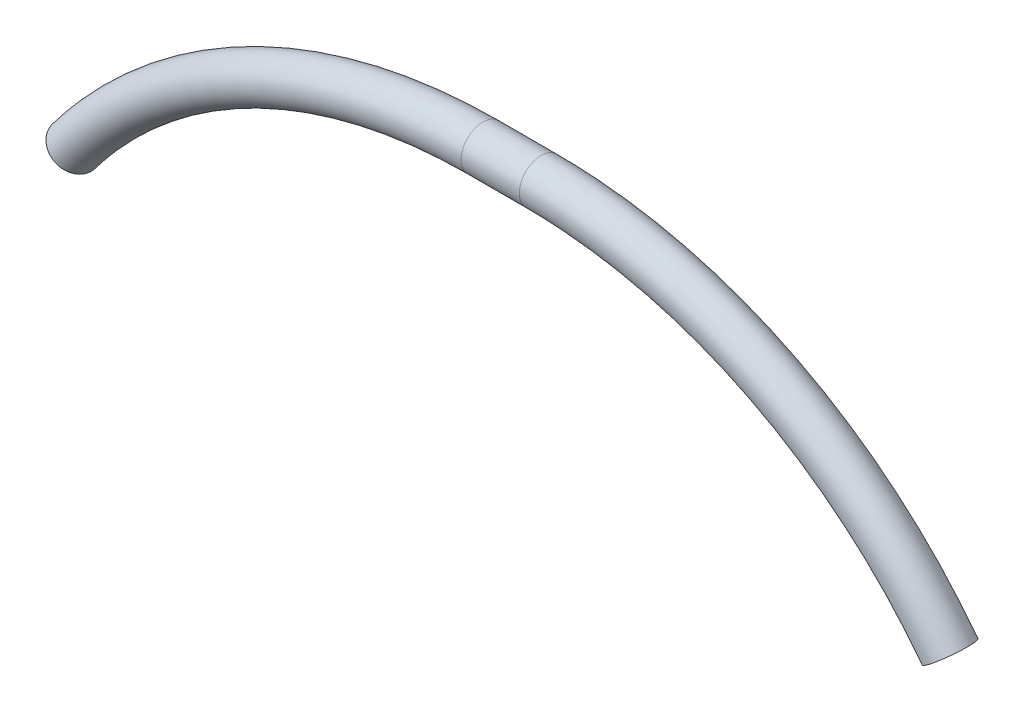
ISO-10303-21;
HEADER;
FILE_DESCRIPTION(('STEP AP214'),'2;1');
FILE_NAME('part.step','',(''),(''),'','','');
FILE_SCHEMA(('AUTOMOTIVE_DESIGN { 1 0 10303 214 1 1 1 1 }'));
ENDSEC;
DATA;
#1=APPLICATION_CONTEXT('core data for automotive mechanical design processes');
#2=APPLICATION_PROTOCOL_DEFINITION('international standard','automotive_design',2000,#1);
#3=PRODUCT_CONTEXT('',#1,'mechanical');
#4=PRODUCT('Part','Part','',(#3));
#5=PRODUCT_RELATED_PRODUCT_CATEGORY('part','',(#4));
#6=PRODUCT_DEFINITION_FORMATION('','',#4);
#7=PRODUCT_DEFINITION_CONTEXT('part definition',#1,'design');
#8=PRODUCT_DEFINITION('design','',#6,#7);
#9=PRODUCT_DEFINITION_SHAPE('','',#8);
#10=(LENGTH_UNIT() NAMED_UNIT(*) SI_UNIT(.MILLI.,.METRE.));
#11=(NAMED_UNIT(*) PLANE_ANGLE_UNIT() SI_UNIT($,.RADIAN.));
#12=(NAMED_UNIT(*) SI_UNIT($,.STERADIAN.) SOLID_ANGLE_UNIT());
#13=UNCERTAINTY_MEASURE_WITH_UNIT(LENGTH_MEASURE(1.E-05),#10,'distance_accuracy_value','');
#14=(GEOMETRIC_REPRESENTATION_CONTEXT(3) GLOBAL_UNCERTAINTY_ASSIGNED_CONTEXT((#13)) GLOBAL_UNIT_ASSIGNED_CONTEXT((#10,
#11,#12)) REPRESENTATION_CONTEXT('',''));
#15=CARTESIAN_POINT('',(0.,0.,0.));
#16=DIRECTION('',(0.,0.,1.));
#17=DIRECTION('',(1.,0.,0.));
#18=AXIS2_PLACEMENT_3D('',#15,#16,#17);
#19=CARTESIAN_POINT('',(6.35,0.,0.));
#20=DIRECTION('',(-1.,0.,0.));
#21=DIRECTION('',(0.,0.,1.));
#22=AXIS2_PLACEMENT_3D('',#19,#20,#21);
#23=CYLINDRICAL_SURFACE('',#22,4.7625);
#24=CARTESIAN_POINT('',(6.35,0.,0.));
#25=DIRECTION('',(1.,0.,0.));
#26=DIRECTION('',(0.,0.,-1.));
#27=AXIS2_PLACEMENT_3D('',#24,#25,#26);
#28=CIRCLE('',#27,4.7625);
#29=CARTESIAN_POINT('',(6.35,0.,-4.7625));
#30=VERTEX_POINT('',#29);
#31=EDGE_CURVE('E11',#30,#30,#28,.T.);
#32=ORIENTED_EDGE('',*,*,#31,.F.);
#33=EDGE_LOOP('',(#32));
#34=FACE_BOUND('',#33,.T.);
#35=CARTESIAN_POINT('',(-6.35,0.,0.));
#36=DIRECTION('',(-1.,0.,0.));
#37=DIRECTION('',(0.,0.,1.));
#38=AXIS2_PLACEMENT_3D('',#35,#36,#37);
#39=CIRCLE('',#38,4.7625);
#40=CARTESIAN_POINT('',(-6.35,0.,4.7625));
#41=VERTEX_POINT('',#40);
#42=EDGE_CURVE('E75',#41,#41,#39,.T.);
#43=ORIENTED_EDGE('',*,*,#42,.F.);
#44=EDGE_LOOP('',(#43));
#45=FACE_BOUND('',#44,.T.);
#46=ADVANCED_FACE('F39',(#34,#45),#23,.T.);
#47=CARTESIAN_POINT('',(6.35,0.,0.));
#48=DIRECTION('',(-1.,0.,0.));
#49=DIRECTION('',(0.,0.,1.));
#50=AXIS2_PLACEMENT_3D('',#47,#48,#49);
#51=CYLINDRICAL_SURFACE('',#50,3.175);
#52=CARTESIAN_POINT('',(6.35,0.,0.));
#53=DIRECTION('',(1.,0.,0.));
#54=DIRECTION('',(0.,0.,-1.));
#55=AXIS2_PLACEMENT_3D('',#52,#53,#54);
#56=CIRCLE('',#55,3.175);
#57=CARTESIAN_POINT('',(6.35,0.,-3.175));
#58=VERTEX_POINT('',#57);
#59=EDGE_CURVE('E42',#58,#58,#56,.F.);
#60=ORIENTED_EDGE('',*,*,#59,.F.);
#61=EDGE_LOOP('',(#60));
#62=FACE_BOUND('',#61,.T.);
#63=CARTESIAN_POINT('',(-6.35,0.,0.));
#64=DIRECTION('',(1.,0.,0.));
#65=DIRECTION('',(0.,0.,-1.));
#66=AXIS2_PLACEMENT_3D('',#63,#64,#65);
#67=CIRCLE('',#66,3.175);
#68=CARTESIAN_POINT('',(-6.35,0.,-3.175));
#69=VERTEX_POINT('',#68);
#70=EDGE_CURVE('E48',#69,#69,#67,.T.);
#71=ORIENTED_EDGE('',*,*,#70,.F.);
#72=EDGE_LOOP('',(#71));
#73=FACE_BOUND('',#72,.T.);
#74=ADVANCED_FACE('F92',(#62,#73),#51,.F.);
#75=CARTESIAN_POINT('',(-6.35,-111.910971518862,0.));
#76=DIRECTION('',(0.,0.,1.));
#77=DIRECTION('',(1.,0.,0.));
#78=AXIS2_PLACEMENT_3D('',#75,#76,#77);
#79=TOROIDAL_SURFACE('',#78,111.910971518862,4.7625);
#80=CARTESIAN_POINT('',(-95.642120973952,-44.45,0.));
#81=DIRECTION('',(-0.602809274222876,-0.7978853168914,0.));
#82=DIRECTION('',(0.,0.,1.));
#83=AXIS2_PLACEMENT_3D('',#80,#81,#82);
#84=CIRCLE('',#83,4.7625);
#85=CARTESIAN_POINT('',(-95.642120973952,-44.45,4.7625));
#86=VERTEX_POINT('',#85);
#87=EDGE_CURVE('E53',#86,#86,#84,.T.);
#88=ORIENTED_EDGE('',*,*,#87,.F.);
#89=EDGE_LOOP('',(#88));
#90=FACE_BOUND('',#89,.T.);
#91=ORIENTED_EDGE('',*,*,#42,.T.);
#92=EDGE_LOOP('',(#91));
#93=FACE_BOUND('',#92,.T.);
#94=ADVANCED_FACE('F89',(#90,#93),#79,.T.);
#95=CARTESIAN_POINT('',(-95.642120973952,-44.45,0.));
#96=DIRECTION('',(-0.602809274222876,-0.7978853168914,0.));
#97=DIRECTION('',(0.,0.,1.));
#98=AXIS2_PLACEMENT_3D('',#95,#96,#97);
#99=PLANE('',#98);
#100=CARTESIAN_POINT('',(-95.642120973952,-44.45,0.));
#101=DIRECTION('',(-0.602809274222876,-0.7978853168914,0.));
#102=DIRECTION('',(0.,0.,1.));
#103=AXIS2_PLACEMENT_3D('',#100,#101,#102);
#104=CIRCLE('',#103,3.175);
#105=CARTESIAN_POINT('',(-95.642120973952,-44.45,3.175));
#106=VERTEX_POINT('',#105);
#107=EDGE_CURVE('E58',#106,#106,#104,.F.);
#108=ORIENTED_EDGE('',*,*,#107,.T.);
#109=EDGE_LOOP('',(#108));
#110=FACE_BOUND('',#109,.T.);
#111=ORIENTED_EDGE('',*,*,#87,.T.);
#112=EDGE_LOOP('',(#111));
#113=FACE_BOUND('',#112,.T.);
#114=ADVANCED_FACE('F118',(#110,#113),#99,.T.);
#115=CARTESIAN_POINT('',(-6.35,-111.910971518862,0.));
#116=DIRECTION('',(0.,0.,1.));
#117=DIRECTION('',(1.,0.,0.));
#118=AXIS2_PLACEMENT_3D('',#115,#116,#117);
#119=TOROIDAL_SURFACE('',#118,111.910971518862,3.175);
#120=ORIENTED_EDGE('',*,*,#107,.F.);
#121=EDGE_LOOP('',(#120));
#122=FACE_BOUND('',#121,.T.);
#123=ORIENTED_EDGE('',*,*,#70,.T.);
#124=EDGE_LOOP('',(#123));
#125=FACE_BOUND('',#124,.T.);
#126=ADVANCED_FACE('F98',(#122,#125),#119,.F.);
#127=CARTESIAN_POINT('',(6.34999999999999,-111.910971518862,0.));
#128=DIRECTION('',(0.,0.,1.));
#129=DIRECTION('',(1.,0.,0.));
#130=AXIS2_PLACEMENT_3D('',#127,#128,#129);
#131=TOROIDAL_SURFACE('',#130,111.910971518862,4.7625);
#132=ORIENTED_EDGE('',*,*,#31,.T.);
#133=EDGE_LOOP('',(#132));
#134=FACE_BOUND('',#133,.T.);
#135=CARTESIAN_POINT('',(95.642120973952,-44.45,0.));
#136=DIRECTION('',(0.602809274222876,-0.7978853168914,0.));
#137=DIRECTION('',(0.,0.,-1.));
#138=AXIS2_PLACEMENT_3D('',#135,#136,#137);
#139=CIRCLE('',#138,4.7625);
#140=CARTESIAN_POINT('',(95.642120973952,-44.45,-4.7625));
#141=VERTEX_POINT('',#140);
#142=EDGE_CURVE('E70',#141,#141,#139,.T.);
#143=ORIENTED_EDGE('',*,*,#142,.F.);
#144=EDGE_LOOP('',(#143));
#145=FACE_BOUND('',#144,.T.);
#146=ADVANCED_FACE('F101',(#134,#145),#131,.T.);
#147=CARTESIAN_POINT('',(95.642120973952,-44.45,0.));
#148=DIRECTION('',(0.602809274222876,-0.7978853168914,0.));
#149=DIRECTION('',(0.,0.,-1.));
#150=AXIS2_PLACEMENT_3D('',#147,#148,#149);
#151=PLANE('',#150);
#152=CARTESIAN_POINT('',(95.642120973952,-44.45,0.));
#153=DIRECTION('',(0.602809274222876,-0.7978853168914,0.));
#154=DIRECTION('',(0.,0.,-1.));
#155=AXIS2_PLACEMENT_3D('',#152,#153,#154);
#156=CIRCLE('',#155,3.175);
#157=CARTESIAN_POINT('',(95.642120973952,-44.45,-3.175));
#158=VERTEX_POINT('',#157);
#159=EDGE_CURVE('E66',#158,#158,#156,.F.);
#160=ORIENTED_EDGE('',*,*,#159,.T.);
#161=EDGE_LOOP('',(#160));
#162=FACE_BOUND('',#161,.T.);
#163=ORIENTED_EDGE('',*,*,#142,.T.);
#164=EDGE_LOOP('',(#163));
#165=FACE_BOUND('',#164,.T.);
#166=ADVANCED_FACE('F104',(#162,#165),#151,.T.);
#167=CARTESIAN_POINT('',(6.34999999999999,-111.910971518862,0.));
#168=DIRECTION('',(0.,0.,1.));
#169=DIRECTION('',(1.,0.,0.));
#170=AXIS2_PLACEMENT_3D('',#167,#168,#169);
#171=TOROIDAL_SURFACE('',#170,111.910971518862,3.175);
#172=ORIENTED_EDGE('',*,*,#59,.T.);
#173=EDGE_LOOP('',(#172));
#174=FACE_BOUND('',#173,.T.);
#175=ORIENTED_EDGE('',*,*,#159,.F.);
#176=EDGE_LOOP('',(#175));
#177=FACE_BOUND('',#176,.T.);
#178=ADVANCED_FACE('F67',(#174,#177),#171,.F.);
#179=CLOSED_SHELL('',(#46,#74,#94,#114,#126,#146,#166,#178));
#180=MANIFOLD_SOLID_BREP('B2',#179);
#181=ADVANCED_BREP_SHAPE_REPRESENTATION('',(#18,#180),#14);
#182=SHAPE_DEFINITION_REPRESENTATION(#9,#181);
ENDSEC;
END-ISO-10303-21;
